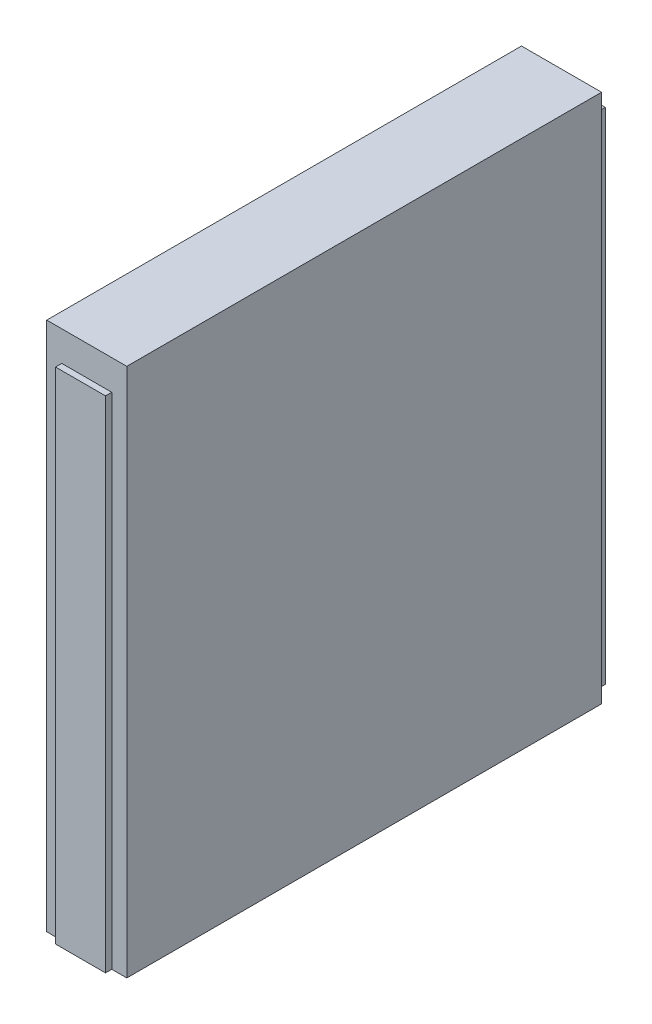
ISO-10303-21;
HEADER;
FILE_DESCRIPTION(('STEP AP214'),'2;1');
FILE_NAME('part.step','',(''),(''),'','','');
FILE_SCHEMA(('AUTOMOTIVE_DESIGN { 1 0 10303 214 1 1 1 1 }'));
ENDSEC;
DATA;
#1=APPLICATION_CONTEXT('core data for automotive mechanical design processes');
#2=APPLICATION_PROTOCOL_DEFINITION('international standard','automotive_design',2000,#1);
#3=PRODUCT_CONTEXT('',#1,'mechanical');
#4=PRODUCT('Part','Part','',(#3));
#5=PRODUCT_RELATED_PRODUCT_CATEGORY('part','',(#4));
#6=PRODUCT_DEFINITION_FORMATION('','',#4);
#7=PRODUCT_DEFINITION_CONTEXT('part definition',#1,'design');
#8=PRODUCT_DEFINITION('design','',#6,#7);
#9=PRODUCT_DEFINITION_SHAPE('','',#8);
#10=(LENGTH_UNIT() NAMED_UNIT(*) SI_UNIT(.MILLI.,.METRE.));
#11=(NAMED_UNIT(*) PLANE_ANGLE_UNIT() SI_UNIT($,.RADIAN.));
#12=(NAMED_UNIT(*) SI_UNIT($,.STERADIAN.) SOLID_ANGLE_UNIT());
#13=UNCERTAINTY_MEASURE_WITH_UNIT(LENGTH_MEASURE(1.E-05),#10,'distance_accuracy_value','');
#14=(GEOMETRIC_REPRESENTATION_CONTEXT(3) GLOBAL_UNCERTAINTY_ASSIGNED_CONTEXT((#13)) GLOBAL_UNIT_ASSIGNED_CONTEXT((#10,
#11,#12)) REPRESENTATION_CONTEXT('',''));
#15=CARTESIAN_POINT('',(0.,0.,0.));
#16=DIRECTION('',(0.,0.,1.));
#17=DIRECTION('',(1.,0.,0.));
#18=AXIS2_PLACEMENT_3D('',#15,#16,#17);
#19=CARTESIAN_POINT('',(32.0333376982642,224.,395.));
#20=DIRECTION('',(1.,0.,0.));
#21=DIRECTION('',(0.,0.,-1.));
#22=AXIS2_PLACEMENT_3D('',#19,#20,#21);
#23=PLANE('',#22);
#24=DIRECTION('',(0.,0.,1.));
#25=VECTOR('',#24,1.);
#26=CARTESIAN_POINT('',(32.0333376982642,-200.,395.));
#27=LINE('',#26,#25);
#28=CARTESIAN_POINT('',(32.0333376982642,-200.,15.));
#29=VERTEX_POINT('',#28);
#30=CARTESIAN_POINT('',(32.0333376982642,-200.,395.));
#31=VERTEX_POINT('',#30);
#32=EDGE_CURVE('E119',#29,#31,#27,.T.);
#33=ORIENTED_EDGE('',*,*,#32,.F.);
#34=DIRECTION('',(0.,-1.,0.));
#35=VECTOR('',#34,1.);
#36=CARTESIAN_POINT('',(32.0333376982642,224.,15.));
#37=LINE('',#36,#35);
#38=CARTESIAN_POINT('',(32.0333376982642,224.,15.));
#39=VERTEX_POINT('',#38);
#40=EDGE_CURVE('E12',#39,#29,#37,.T.);
#41=ORIENTED_EDGE('',*,*,#40,.F.);
#42=DIRECTION('',(0.,0.,1.));
#43=VECTOR('',#42,1.);
#44=CARTESIAN_POINT('',(32.0333376982642,224.,395.));
#45=LINE('',#44,#43);
#46=CARTESIAN_POINT('',(32.0333376982642,224.,395.));
#47=VERTEX_POINT('',#46);
#48=EDGE_CURVE('E113',#39,#47,#45,.T.);
#49=ORIENTED_EDGE('',*,*,#48,.T.);
#50=DIRECTION('',(0.,-1.,0.));
#51=VECTOR('',#50,1.);
#52=CARTESIAN_POINT('',(32.0333376982642,224.,395.));
#53=LINE('',#52,#51);
#54=EDGE_CURVE('E58',#47,#31,#53,.T.);
#55=ORIENTED_EDGE('',*,*,#54,.T.);
#56=EDGE_LOOP('',(#33,#41,#49,#55));
#57=FACE_BOUND('',#56,.T.);
#58=ADVANCED_FACE('F55',(#57),#23,.T.);
#59=CARTESIAN_POINT('',(-32.0333376982642,224.,15.));
#60=DIRECTION('',(0.,0.,-1.));
#61=DIRECTION('',(-1.,0.,0.));
#62=AXIS2_PLACEMENT_3D('',#59,#60,#61);
#63=PLANE('',#62);
#64=DIRECTION('',(1.,0.,0.));
#65=VECTOR('',#64,1.);
#66=CARTESIAN_POINT('',(-32.0333376982642,-200.,15.));
#67=LINE('',#66,#65);
#68=CARTESIAN_POINT('',(-32.0333376982642,-200.,15.));
#69=VERTEX_POINT('',#68);
#70=EDGE_CURVE('E115',#69,#29,#67,.T.);
#71=ORIENTED_EDGE('',*,*,#70,.F.);
#72=DIRECTION('',(0.,-1.,0.));
#73=VECTOR('',#72,1.);
#74=CARTESIAN_POINT('',(-32.0333376982642,224.,15.));
#75=LINE('',#74,#73);
#76=CARTESIAN_POINT('',(-32.0333376982642,224.,15.));
#77=VERTEX_POINT('',#76);
#78=EDGE_CURVE('E64',#77,#69,#75,.T.);
#79=ORIENTED_EDGE('',*,*,#78,.F.);
#80=DIRECTION('',(1.,0.,0.));
#81=VECTOR('',#80,1.);
#82=CARTESIAN_POINT('',(-32.0333376982642,224.,15.));
#83=LINE('',#82,#81);
#84=EDGE_CURVE('E110',#77,#39,#83,.T.);
#85=ORIENTED_EDGE('',*,*,#84,.T.);
#86=ORIENTED_EDGE('',*,*,#40,.T.);
#87=EDGE_LOOP('',(#71,#79,#85,#86));
#88=FACE_BOUND('',#87,.T.);
#89=ADVANCED_FACE('F129',(#88),#63,.T.);
#90=CARTESIAN_POINT('',(-32.0333376982642,224.,395.));
#91=DIRECTION('',(-1.,0.,0.));
#92=DIRECTION('',(0.,0.,1.));
#93=AXIS2_PLACEMENT_3D('',#90,#91,#92);
#94=PLANE('',#93);
#95=DIRECTION('',(0.,0.,-1.));
#96=VECTOR('',#95,1.);
#97=CARTESIAN_POINT('',(-32.0333376982642,-200.,395.));
#98=LINE('',#97,#96);
#99=CARTESIAN_POINT('',(-32.0333376982642,-200.,395.));
#100=VERTEX_POINT('',#99);
#101=EDGE_CURVE('E105',#100,#69,#98,.T.);
#102=ORIENTED_EDGE('',*,*,#101,.F.);
#103=DIRECTION('',(0.,-1.,0.));
#104=VECTOR('',#103,1.);
#105=CARTESIAN_POINT('',(-32.0333376982642,224.,395.));
#106=LINE('',#105,#104);
#107=CARTESIAN_POINT('',(-32.0333376982642,224.,395.));
#108=VERTEX_POINT('',#107);
#109=EDGE_CURVE('E100',#108,#100,#106,.T.);
#110=ORIENTED_EDGE('',*,*,#109,.F.);
#111=DIRECTION('',(0.,0.,-1.));
#112=VECTOR('',#111,1.);
#113=CARTESIAN_POINT('',(-32.0333376982642,224.,395.));
#114=LINE('',#113,#112);
#115=EDGE_CURVE('E103',#108,#77,#114,.T.);
#116=ORIENTED_EDGE('',*,*,#115,.T.);
#117=ORIENTED_EDGE('',*,*,#78,.T.);
#118=EDGE_LOOP('',(#102,#110,#116,#117));
#119=FACE_BOUND('',#118,.T.);
#120=ADVANCED_FACE('F102',(#119),#94,.T.);
#121=CARTESIAN_POINT('',(-32.0333376982642,224.,395.));
#122=DIRECTION('',(0.,0.,1.));
#123=DIRECTION('',(1.,0.,0.));
#124=AXIS2_PLACEMENT_3D('',#121,#122,#123);
#125=PLANE('',#124);
#126=DIRECTION('',(-1.,0.,0.));
#127=VECTOR('',#126,1.);
#128=CARTESIAN_POINT('',(-32.0333376982642,-200.,395.));
#129=LINE('',#128,#127);
#130=EDGE_CURVE('E122',#31,#100,#129,.T.);
#131=ORIENTED_EDGE('',*,*,#130,.F.);
#132=ORIENTED_EDGE('',*,*,#54,.F.);
#133=DIRECTION('',(-1.,0.,0.));
#134=VECTOR('',#133,1.);
#135=CARTESIAN_POINT('',(-32.0333376982642,224.,395.));
#136=LINE('',#135,#134);
#137=EDGE_CURVE('E109',#47,#108,#136,.T.);
#138=ORIENTED_EDGE('',*,*,#137,.T.);
#139=ORIENTED_EDGE('',*,*,#109,.T.);
#140=EDGE_LOOP('',(#131,#132,#138,#139));
#141=FACE_BOUND('',#140,.T.);
#142=ADVANCED_FACE('F112',(#141),#125,.T.);
#143=CARTESIAN_POINT('',(0.,224.,0.));
#144=DIRECTION('',(0.,-1.,0.));
#145=DIRECTION('',(0.,0.,-1.));
#146=AXIS2_PLACEMENT_3D('',#143,#144,#145);
#147=PLANE('',#146);
#148=ORIENTED_EDGE('',*,*,#48,.F.);
#149=ORIENTED_EDGE('',*,*,#84,.F.);
#150=ORIENTED_EDGE('',*,*,#115,.F.);
#151=ORIENTED_EDGE('',*,*,#137,.F.);
#152=EDGE_LOOP('',(#148,#149,#150,#151));
#153=FACE_BOUND('',#152,.T.);
#154=ADVANCED_FACE('F108',(#153),#147,.F.);
#155=CARTESIAN_POINT('',(0.,-200.,0.));
#156=DIRECTION('',(0.,-1.,0.));
#157=DIRECTION('',(0.,0.,-1.));
#158=AXIS2_PLACEMENT_3D('',#155,#156,#157);
#159=PLANE('',#158);
#160=ORIENTED_EDGE('',*,*,#32,.T.);
#161=ORIENTED_EDGE('',*,*,#130,.T.);
#162=ORIENTED_EDGE('',*,*,#101,.T.);
#163=ORIENTED_EDGE('',*,*,#70,.T.);
#164=EDGE_LOOP('',(#160,#161,#162,#163));
#165=FACE_BOUND('',#164,.T.);
#166=ADVANCED_FACE('F128',(#165),#159,.T.);
#167=CLOSED_SHELL('',(#58,#89,#120,#142,#154,#166));
#168=MANIFOLD_SOLID_BREP('B2',#167);
#169=CARTESIAN_POINT('',(20.,200.,400.));
#170=DIRECTION('',(-1.,0.,0.));
#171=DIRECTION('',(0.,-1.,0.));
#172=AXIS2_PLACEMENT_3D('',#169,#170,#171);
#173=PLANE('',#172);
#174=DIRECTION('',(0.,1.,0.));
#175=VECTOR('',#174,1.);
#176=CARTESIAN_POINT('',(20.,200.,0.));
#177=LINE('',#176,#175);
#178=CARTESIAN_POINT('',(20.,-200.,0.));
#179=VERTEX_POINT('',#178);
#180=CARTESIAN_POINT('',(20.,200.,0.));
#181=VERTEX_POINT('',#180);
#182=EDGE_CURVE('E242',#179,#181,#177,.T.);
#183=ORIENTED_EDGE('',*,*,#182,.T.);
#184=DIRECTION('',(0.,0.,-1.));
#185=VECTOR('',#184,1.);
#186=CARTESIAN_POINT('',(20.,200.,400.));
#187=LINE('',#186,#185);
#188=CARTESIAN_POINT('',(20.,200.,400.));
#189=VERTEX_POINT('',#188);
#190=EDGE_CURVE('E53',#189,#181,#187,.T.);
#191=ORIENTED_EDGE('',*,*,#190,.F.);
#192=DIRECTION('',(0.,1.,0.));
#193=VECTOR('',#192,1.);
#194=CARTESIAN_POINT('',(20.,200.,400.));
#195=LINE('',#194,#193);
#196=CARTESIAN_POINT('',(20.,-200.,400.));
#197=VERTEX_POINT('',#196);
#198=EDGE_CURVE('E230',#197,#189,#195,.T.);
#199=ORIENTED_EDGE('',*,*,#198,.F.);
#200=DIRECTION('',(0.,0.,-1.));
#201=VECTOR('',#200,1.);
#202=CARTESIAN_POINT('',(20.,-200.,400.));
#203=LINE('',#202,#201);
#204=EDGE_CURVE('E238',#197,#179,#203,.T.);
#205=ORIENTED_EDGE('',*,*,#204,.T.);
#206=EDGE_LOOP('',(#183,#191,#199,#205));
#207=FACE_BOUND('',#206,.T.);
#208=ADVANCED_FACE('F179',(#207),#173,.F.);
#209=CARTESIAN_POINT('',(-20.,200.,400.));
#210=DIRECTION('',(0.,-1.,0.));
#211=DIRECTION('',(0.,0.,-1.));
#212=AXIS2_PLACEMENT_3D('',#209,#210,#211);
#213=PLANE('',#212);
#214=DIRECTION('',(-1.,0.,0.));
#215=VECTOR('',#214,1.);
#216=CARTESIAN_POINT('',(-20.,200.,0.));
#217=LINE('',#216,#215);
#218=CARTESIAN_POINT('',(-20.,200.,0.));
#219=VERTEX_POINT('',#218);
#220=EDGE_CURVE('E234',#181,#219,#217,.T.);
#221=ORIENTED_EDGE('',*,*,#220,.T.);
#222=DIRECTION('',(0.,0.,-1.));
#223=VECTOR('',#222,1.);
#224=CARTESIAN_POINT('',(-20.,200.,400.));
#225=LINE('',#224,#223);
#226=CARTESIAN_POINT('',(-20.,200.,400.));
#227=VERTEX_POINT('',#226);
#228=EDGE_CURVE('E187',#227,#219,#225,.T.);
#229=ORIENTED_EDGE('',*,*,#228,.F.);
#230=DIRECTION('',(-1.,0.,0.));
#231=VECTOR('',#230,1.);
#232=CARTESIAN_POINT('',(-20.,200.,400.));
#233=LINE('',#232,#231);
#234=EDGE_CURVE('E225',#189,#227,#233,.T.);
#235=ORIENTED_EDGE('',*,*,#234,.F.);
#236=ORIENTED_EDGE('',*,*,#190,.T.);
#237=EDGE_LOOP('',(#221,#229,#235,#236));
#238=FACE_BOUND('',#237,.T.);
#239=ADVANCED_FACE('F233',(#238),#213,.F.);
#240=CARTESIAN_POINT('',(-20.,200.,400.));
#241=DIRECTION('',(1.,0.,0.));
#242=DIRECTION('',(0.,1.,0.));
#243=AXIS2_PLACEMENT_3D('',#240,#241,#242);
#244=PLANE('',#243);
#245=DIRECTION('',(0.,-1.,0.));
#246=VECTOR('',#245,1.);
#247=CARTESIAN_POINT('',(-20.,200.,0.));
#248=LINE('',#247,#246);
#249=CARTESIAN_POINT('',(-20.,-200.,0.));
#250=VERTEX_POINT('',#249);
#251=EDGE_CURVE('E212',#219,#250,#248,.T.);
#252=ORIENTED_EDGE('',*,*,#251,.T.);
#253=DIRECTION('',(0.,0.,-1.));
#254=VECTOR('',#253,1.);
#255=CARTESIAN_POINT('',(-20.,-200.,400.));
#256=LINE('',#255,#254);
#257=CARTESIAN_POINT('',(-20.,-200.,400.));
#258=VERTEX_POINT('',#257);
#259=EDGE_CURVE('E235',#258,#250,#256,.T.);
#260=ORIENTED_EDGE('',*,*,#259,.F.);
#261=DIRECTION('',(0.,-1.,0.));
#262=VECTOR('',#261,1.);
#263=CARTESIAN_POINT('',(-20.,200.,400.));
#264=LINE('',#263,#262);
#265=EDGE_CURVE('E228',#227,#258,#264,.T.);
#266=ORIENTED_EDGE('',*,*,#265,.F.);
#267=ORIENTED_EDGE('',*,*,#228,.T.);
#268=EDGE_LOOP('',(#252,#260,#266,#267));
#269=FACE_BOUND('',#268,.T.);
#270=ADVANCED_FACE('F236',(#269),#244,.F.);
#271=CARTESIAN_POINT('',(-20.,-200.,400.));
#272=DIRECTION('',(0.,1.,0.));
#273=DIRECTION('',(0.,0.,1.));
#274=AXIS2_PLACEMENT_3D('',#271,#272,#273);
#275=PLANE('',#274);
#276=DIRECTION('',(1.,0.,0.));
#277=VECTOR('',#276,1.);
#278=CARTESIAN_POINT('',(-20.,-200.,0.));
#279=LINE('',#278,#277);
#280=EDGE_CURVE('E218',#250,#179,#279,.T.);
#281=ORIENTED_EDGE('',*,*,#280,.T.);
#282=ORIENTED_EDGE('',*,*,#204,.F.);
#283=DIRECTION('',(1.,0.,0.));
#284=VECTOR('',#283,1.);
#285=CARTESIAN_POINT('',(-20.,-200.,400.));
#286=LINE('',#285,#284);
#287=EDGE_CURVE('E195',#258,#197,#286,.T.);
#288=ORIENTED_EDGE('',*,*,#287,.F.);
#289=ORIENTED_EDGE('',*,*,#259,.T.);
#290=EDGE_LOOP('',(#281,#282,#288,#289));
#291=FACE_BOUND('',#290,.T.);
#292=ADVANCED_FACE('F249',(#291),#275,.F.);
#293=CARTESIAN_POINT('',(0.,0.,400.));
#294=DIRECTION('',(0.,0.,1.));
#295=DIRECTION('',(1.,0.,0.));
#296=AXIS2_PLACEMENT_3D('',#293,#294,#295);
#297=PLANE('',#296);
#298=ORIENTED_EDGE('',*,*,#198,.T.);
#299=ORIENTED_EDGE('',*,*,#234,.T.);
#300=ORIENTED_EDGE('',*,*,#265,.T.);
#301=ORIENTED_EDGE('',*,*,#287,.T.);
#302=EDGE_LOOP('',(#298,#299,#300,#301));
#303=FACE_BOUND('',#302,.T.);
#304=ADVANCED_FACE('F226',(#303),#297,.T.);
#305=CARTESIAN_POINT('',(0.,0.,0.));
#306=DIRECTION('',(0.,0.,1.));
#307=DIRECTION('',(1.,0.,0.));
#308=AXIS2_PLACEMENT_3D('',#305,#306,#307);
#309=PLANE('',#308);
#310=ORIENTED_EDGE('',*,*,#182,.F.);
#311=ORIENTED_EDGE('',*,*,#280,.F.);
#312=ORIENTED_EDGE('',*,*,#251,.F.);
#313=ORIENTED_EDGE('',*,*,#220,.F.);
#314=EDGE_LOOP('',(#310,#311,#312,#313));
#315=FACE_BOUND('',#314,.T.);
#316=ADVANCED_FACE('F252',(#315),#309,.F.);
#317=CLOSED_SHELL('',(#208,#239,#270,#292,#304,#316));
#318=MANIFOLD_SOLID_BREP('B6',#317);
#319=ADVANCED_BREP_SHAPE_REPRESENTATION('',(#18,#168,#318),#14);
#320=SHAPE_DEFINITION_REPRESENTATION(#9,#319);
ENDSEC;
END-ISO-10303-21;
